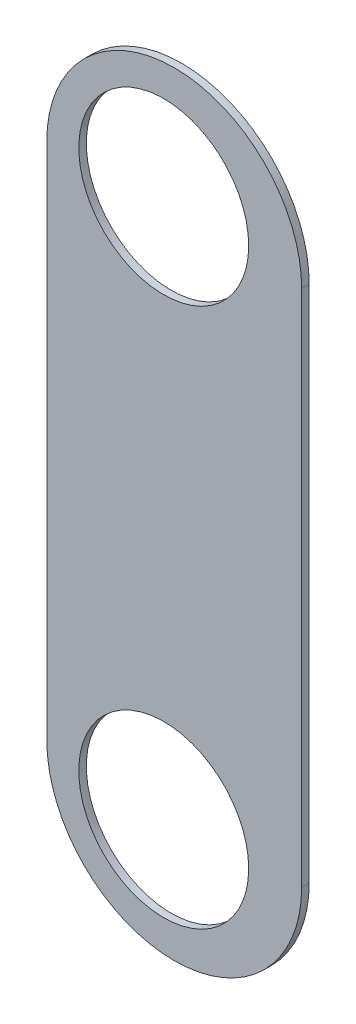
ISO-10303-21;
HEADER;
FILE_DESCRIPTION(('STEP AP214'),'2;1');
FILE_NAME('part.step','',(''),(''),'','','');
FILE_SCHEMA(('AUTOMOTIVE_DESIGN { 1 0 10303 214 1 1 1 1 }'));
ENDSEC;
DATA;
#1=APPLICATION_CONTEXT('core data for automotive mechanical design processes');
#2=APPLICATION_PROTOCOL_DEFINITION('international standard','automotive_design',2000,#1);
#3=PRODUCT_CONTEXT('',#1,'mechanical');
#4=PRODUCT('Part','Part','',(#3));
#5=PRODUCT_RELATED_PRODUCT_CATEGORY('part','',(#4));
#6=PRODUCT_DEFINITION_FORMATION('','',#4);
#7=PRODUCT_DEFINITION_CONTEXT('part definition',#1,'design');
#8=PRODUCT_DEFINITION('design','',#6,#7);
#9=PRODUCT_DEFINITION_SHAPE('','',#8);
#10=(LENGTH_UNIT() NAMED_UNIT(*) SI_UNIT(.MILLI.,.METRE.));
#11=(NAMED_UNIT(*) PLANE_ANGLE_UNIT() SI_UNIT($,.RADIAN.));
#12=(NAMED_UNIT(*) SI_UNIT($,.STERADIAN.) SOLID_ANGLE_UNIT());
#13=UNCERTAINTY_MEASURE_WITH_UNIT(LENGTH_MEASURE(1.E-05),#10,'distance_accuracy_value','');
#14=(GEOMETRIC_REPRESENTATION_CONTEXT(3) GLOBAL_UNCERTAINTY_ASSIGNED_CONTEXT((#13)) GLOBAL_UNIT_ASSIGNED_CONTEXT((#10,
#11,#12)) REPRESENTATION_CONTEXT('',''));
#15=CARTESIAN_POINT('',(0.,0.,0.));
#16=DIRECTION('',(0.,0.,1.));
#17=DIRECTION('',(1.,0.,0.));
#18=AXIS2_PLACEMENT_3D('',#15,#16,#17);
#19=CARTESIAN_POINT('',(67.42938,88.0893844,0.));
#20=DIRECTION('',(-1.,0.,0.));
#21=DIRECTION('',(0.,1.,0.));
#22=AXIS2_PLACEMENT_3D('',#19,#20,#21);
#23=PLANE('',#22);
#24=DIRECTION('',(0.,1.,0.));
#25=VECTOR('',#24,1.);
#26=CARTESIAN_POINT('',(67.42938,88.0893844,0.03556));
#27=LINE('',#26,#25);
#28=CARTESIAN_POINT('',(67.42938,88.0893844,0.03556));
#29=VERTEX_POINT('',#28);
#30=CARTESIAN_POINT('',(67.42938,90.5306292,0.03556));
#31=VERTEX_POINT('',#30);
#32=EDGE_CURVE('E11',#29,#31,#27,.T.);
#33=ORIENTED_EDGE('',*,*,#32,.F.);
#34=DIRECTION('',(0.,0.,1.));
#35=VECTOR('',#34,1.);
#36=CARTESIAN_POINT('',(67.42938,88.0893844,0.));
#37=LINE('',#36,#35);
#38=CARTESIAN_POINT('',(67.42938,88.0893844,0.));
#39=VERTEX_POINT('',#38);
#40=EDGE_CURVE('E24',#39,#29,#37,.T.);
#41=ORIENTED_EDGE('',*,*,#40,.F.);
#42=DIRECTION('',(0.,1.,0.));
#43=VECTOR('',#42,1.);
#44=CARTESIAN_POINT('',(67.42938,88.0893844,0.));
#45=LINE('',#44,#43);
#46=CARTESIAN_POINT('',(67.42938,90.5306292,0.));
#47=VERTEX_POINT('',#46);
#48=EDGE_CURVE('E110',#39,#47,#45,.T.);
#49=ORIENTED_EDGE('',*,*,#48,.T.);
#50=DIRECTION('',(0.,0.,1.));
#51=VECTOR('',#50,1.);
#52=CARTESIAN_POINT('',(67.42938,90.5306292,0.));
#53=LINE('',#52,#51);
#54=EDGE_CURVE('E37',#47,#31,#53,.T.);
#55=ORIENTED_EDGE('',*,*,#54,.T.);
#56=EDGE_LOOP('',(#33,#41,#49,#55));
#57=FACE_BOUND('',#56,.T.);
#58=ADVANCED_FACE('F17',(#57),#23,.F.);
#59=CARTESIAN_POINT('',(66.8293812,88.0893844,0.));
#60=DIRECTION('',(0.,0.,-1.));
#61=DIRECTION('',(-1.,0.,0.));
#62=AXIS2_PLACEMENT_3D('',#59,#60,#61);
#63=CYLINDRICAL_SURFACE('',#62,0.599998799999995);
#64=CARTESIAN_POINT('',(66.8293812,88.0893844,0.03556));
#65=DIRECTION('',(0.,0.,1.));
#66=DIRECTION('',(-1.,0.,0.));
#67=AXIS2_PLACEMENT_3D('',#64,#65,#66);
#68=CIRCLE('',#67,0.599998799999995);
#69=CARTESIAN_POINT('',(66.2293824,88.0893844,0.03556));
#70=VERTEX_POINT('',#69);
#71=EDGE_CURVE('E106',#70,#29,#68,.T.);
#72=ORIENTED_EDGE('',*,*,#71,.F.);
#73=DIRECTION('',(0.,0.,1.));
#74=VECTOR('',#73,1.);
#75=CARTESIAN_POINT('',(66.2293824,88.0893844,0.));
#76=LINE('',#75,#74);
#77=CARTESIAN_POINT('',(66.2293824,88.0893844,0.));
#78=VERTEX_POINT('',#77);
#79=EDGE_CURVE('E104',#78,#70,#76,.T.);
#80=ORIENTED_EDGE('',*,*,#79,.F.);
#81=CARTESIAN_POINT('',(66.8293812,88.0893844,0.));
#82=DIRECTION('',(0.,0.,1.));
#83=DIRECTION('',(-1.,0.,0.));
#84=AXIS2_PLACEMENT_3D('',#81,#82,#83);
#85=CIRCLE('',#84,0.599998799999995);
#86=EDGE_CURVE('E102',#78,#39,#85,.T.);
#87=ORIENTED_EDGE('',*,*,#86,.T.);
#88=ORIENTED_EDGE('',*,*,#40,.T.);
#89=EDGE_LOOP('',(#72,#80,#87,#88));
#90=FACE_BOUND('',#89,.T.);
#91=ADVANCED_FACE('F126',(#90),#63,.T.);
#92=CARTESIAN_POINT('',(66.8293812,90.5306292,0.));
#93=DIRECTION('',(0.,0.,-1.));
#94=DIRECTION('',(1.,0.,0.));
#95=AXIS2_PLACEMENT_3D('',#92,#93,#94);
#96=CYLINDRICAL_SURFACE('',#95,0.599998799999995);
#97=CARTESIAN_POINT('',(66.8293812,90.5306292,0.03556));
#98=DIRECTION('',(0.,0.,1.));
#99=DIRECTION('',(1.,0.,0.));
#100=AXIS2_PLACEMENT_3D('',#97,#98,#99);
#101=CIRCLE('',#100,0.599998799999995);
#102=CARTESIAN_POINT('',(66.2293824,90.5306292,0.03556));
#103=VERTEX_POINT('',#102);
#104=EDGE_CURVE('E99',#31,#103,#101,.T.);
#105=ORIENTED_EDGE('',*,*,#104,.F.);
#106=ORIENTED_EDGE('',*,*,#54,.F.);
#107=CARTESIAN_POINT('',(66.8293812,90.5306292,0.));
#108=DIRECTION('',(0.,0.,1.));
#109=DIRECTION('',(1.,0.,0.));
#110=AXIS2_PLACEMENT_3D('',#107,#108,#109);
#111=CIRCLE('',#110,0.599998799999995);
#112=CARTESIAN_POINT('',(66.2293824,90.5306292,0.));
#113=VERTEX_POINT('',#112);
#114=EDGE_CURVE('E96',#47,#113,#111,.T.);
#115=ORIENTED_EDGE('',*,*,#114,.T.);
#116=DIRECTION('',(0.,0.,1.));
#117=VECTOR('',#116,1.);
#118=CARTESIAN_POINT('',(66.2293824,90.5306292,0.));
#119=LINE('',#118,#117);
#120=EDGE_CURVE('E94',#113,#103,#119,.T.);
#121=ORIENTED_EDGE('',*,*,#120,.T.);
#122=EDGE_LOOP('',(#105,#106,#115,#121));
#123=FACE_BOUND('',#122,.T.);
#124=ADVANCED_FACE('F119',(#123),#96,.T.);
#125=CARTESIAN_POINT('',(66.2293824,90.5306292,0.));
#126=DIRECTION('',(1.,0.,0.));
#127=DIRECTION('',(0.,-1.,0.));
#128=AXIS2_PLACEMENT_3D('',#125,#126,#127);
#129=PLANE('',#128);
#130=DIRECTION('',(0.,-1.,0.));
#131=VECTOR('',#130,1.);
#132=CARTESIAN_POINT('',(66.2293824,90.5306292,0.03556));
#133=LINE('',#132,#131);
#134=EDGE_CURVE('E91',#103,#70,#133,.T.);
#135=ORIENTED_EDGE('',*,*,#134,.F.);
#136=ORIENTED_EDGE('',*,*,#120,.F.);
#137=DIRECTION('',(0.,-1.,0.));
#138=VECTOR('',#137,1.);
#139=CARTESIAN_POINT('',(66.2293824,90.5306292,0.));
#140=LINE('',#139,#138);
#141=EDGE_CURVE('E88',#113,#78,#140,.T.);
#142=ORIENTED_EDGE('',*,*,#141,.T.);
#143=ORIENTED_EDGE('',*,*,#79,.T.);
#144=EDGE_LOOP('',(#135,#136,#142,#143));
#145=FACE_BOUND('',#144,.T.);
#146=ADVANCED_FACE('F125',(#145),#129,.F.);
#147=CARTESIAN_POINT('',(66.7800036,90.5800068,0.));
#148=DIRECTION('',(0.,0.,-1.));
#149=DIRECTION('',(1.,0.,0.));
#150=AXIS2_PLACEMENT_3D('',#147,#148,#149);
#151=CYLINDRICAL_SURFACE('',#150,0.3999992);
#152=DIRECTION('',(0.,0.,1.));
#153=VECTOR('',#152,1.);
#154=CARTESIAN_POINT('',(67.1800028,90.5800068,0.));
#155=LINE('',#154,#153);
#156=CARTESIAN_POINT('',(67.1800028,90.5800068,0.));
#157=VERTEX_POINT('',#156);
#158=CARTESIAN_POINT('',(67.1800028,90.5800068,0.03556));
#159=VERTEX_POINT('',#158);
#160=EDGE_CURVE('E86',#157,#159,#155,.T.);
#161=ORIENTED_EDGE('',*,*,#160,.T.);
#162=CARTESIAN_POINT('',(66.7800036,90.5800068,0.03556));
#163=DIRECTION('',(0.,0.,1.));
#164=DIRECTION('',(1.,0.,0.));
#165=AXIS2_PLACEMENT_3D('',#162,#163,#164);
#166=CIRCLE('',#165,0.3999992);
#167=EDGE_CURVE('E83',#159,#159,#166,.T.);
#168=ORIENTED_EDGE('',*,*,#167,.T.);
#169=ORIENTED_EDGE('',*,*,#160,.F.);
#170=CARTESIAN_POINT('',(66.7800036,90.5800068,0.));
#171=DIRECTION('',(0.,0.,1.));
#172=DIRECTION('',(1.,0.,0.));
#173=AXIS2_PLACEMENT_3D('',#170,#171,#172);
#174=CIRCLE('',#173,0.3999992);
#175=EDGE_CURVE('E74',#157,#157,#174,.T.);
#176=ORIENTED_EDGE('',*,*,#175,.F.);
#177=EDGE_LOOP('',(#161,#168,#169,#176));
#178=FACE_BOUND('',#177,.T.);
#179=ADVANCED_FACE('F137',(#178),#151,.F.);
#180=CARTESIAN_POINT('',(66.7800036,88.0400068,0.));
#181=DIRECTION('',(0.,0.,-1.));
#182=DIRECTION('',(1.,0.,0.));
#183=AXIS2_PLACEMENT_3D('',#180,#181,#182);
#184=CYLINDRICAL_SURFACE('',#183,0.3999992);
#185=DIRECTION('',(0.,0.,1.));
#186=VECTOR('',#185,1.);
#187=CARTESIAN_POINT('',(67.1800028,88.0400068,0.));
#188=LINE('',#187,#186);
#189=CARTESIAN_POINT('',(67.1800028,88.0400068,0.));
#190=VERTEX_POINT('',#189);
#191=CARTESIAN_POINT('',(67.1800028,88.0400068,0.03556));
#192=VERTEX_POINT('',#191);
#193=EDGE_CURVE('E68',#190,#192,#188,.T.);
#194=ORIENTED_EDGE('',*,*,#193,.T.);
#195=CARTESIAN_POINT('',(66.7800036,88.0400068,0.03556));
#196=DIRECTION('',(0.,0.,1.));
#197=DIRECTION('',(1.,0.,0.));
#198=AXIS2_PLACEMENT_3D('',#195,#196,#197);
#199=CIRCLE('',#198,0.3999992);
#200=EDGE_CURVE('E73',#192,#192,#199,.T.);
#201=ORIENTED_EDGE('',*,*,#200,.T.);
#202=ORIENTED_EDGE('',*,*,#193,.F.);
#203=CARTESIAN_POINT('',(66.7800036,88.0400068,0.));
#204=DIRECTION('',(0.,0.,1.));
#205=DIRECTION('',(1.,0.,0.));
#206=AXIS2_PLACEMENT_3D('',#203,#204,#205);
#207=CIRCLE('',#206,0.3999992);
#208=EDGE_CURVE('E71',#190,#190,#207,.T.);
#209=ORIENTED_EDGE('',*,*,#208,.F.);
#210=EDGE_LOOP('',(#194,#201,#202,#209));
#211=FACE_BOUND('',#210,.T.);
#212=ADVANCED_FACE('F70',(#211),#184,.F.);
#213=CARTESIAN_POINT('',(67.42938,88.0893844,0.));
#214=DIRECTION('',(0.,0.,-1.));
#215=DIRECTION('',(-1.,0.,0.));
#216=AXIS2_PLACEMENT_3D('',#213,#214,#215);
#217=PLANE('',#216);
#218=ORIENTED_EDGE('',*,*,#48,.F.);
#219=ORIENTED_EDGE('',*,*,#86,.F.);
#220=ORIENTED_EDGE('',*,*,#141,.F.);
#221=ORIENTED_EDGE('',*,*,#114,.F.);
#222=EDGE_LOOP('',(#218,#219,#220,#221));
#223=FACE_BOUND('',#222,.T.);
#224=ORIENTED_EDGE('',*,*,#175,.T.);
#225=EDGE_LOOP('',(#224));
#226=FACE_BOUND('',#225,.T.);
#227=ORIENTED_EDGE('',*,*,#208,.T.);
#228=EDGE_LOOP('',(#227));
#229=FACE_BOUND('',#228,.T.);
#230=ADVANCED_FACE('F77',(#223,#226,#229),#217,.T.);
#231=CARTESIAN_POINT('',(67.42938,88.0893844,0.03556));
#232=DIRECTION('',(0.,0.,-1.));
#233=DIRECTION('',(-1.,0.,0.));
#234=AXIS2_PLACEMENT_3D('',#231,#232,#233);
#235=PLANE('',#234);
#236=ORIENTED_EDGE('',*,*,#134,.T.);
#237=ORIENTED_EDGE('',*,*,#71,.T.);
#238=ORIENTED_EDGE('',*,*,#32,.T.);
#239=ORIENTED_EDGE('',*,*,#104,.T.);
#240=EDGE_LOOP('',(#236,#237,#238,#239));
#241=FACE_BOUND('',#240,.T.);
#242=ORIENTED_EDGE('',*,*,#167,.F.);
#243=EDGE_LOOP('',(#242));
#244=FACE_BOUND('',#243,.T.);
#245=ORIENTED_EDGE('',*,*,#200,.F.);
#246=EDGE_LOOP('',(#245));
#247=FACE_BOUND('',#246,.T.);
#248=ADVANCED_FACE('F122',(#241,#244,#247),#235,.F.);
#249=CLOSED_SHELL('',(#58,#91,#124,#146,#179,#212,#230,#248));
#250=MANIFOLD_SOLID_BREP('B1',#249);
#251=ADVANCED_BREP_SHAPE_REPRESENTATION('',(#18,#250),#14);
#252=SHAPE_DEFINITION_REPRESENTATION(#9,#251);
ENDSEC;
END-ISO-10303-21;
